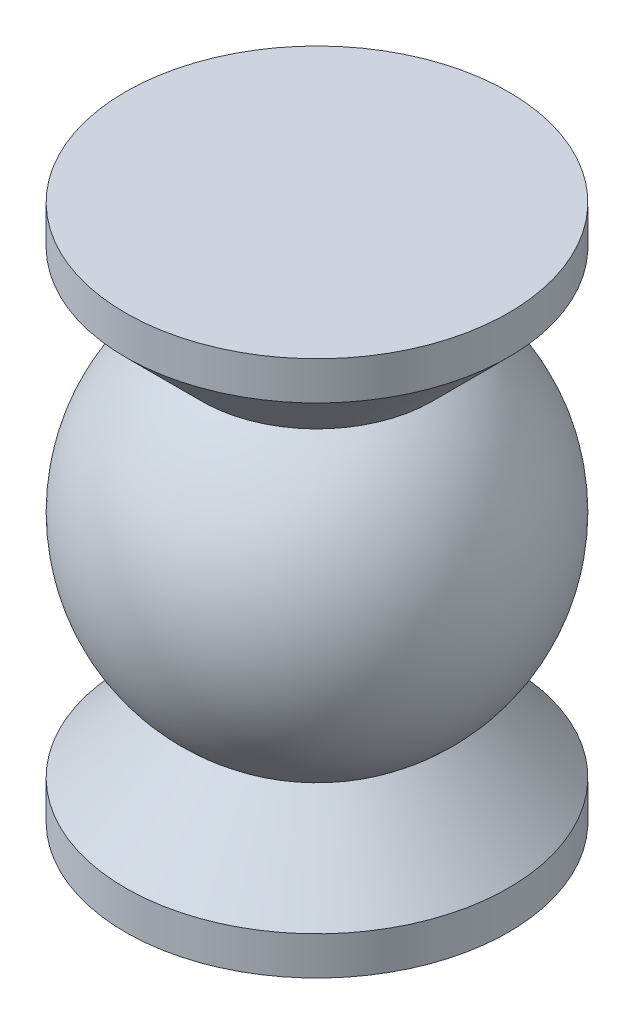
ISO-10303-21;
HEADER;
FILE_DESCRIPTION(('STEP AP214'),'2;1');
FILE_NAME('part.step','',(''),(''),'','','');
FILE_SCHEMA(('AUTOMOTIVE_DESIGN { 1 0 10303 214 1 1 1 1 }'));
ENDSEC;
DATA;
#1=APPLICATION_CONTEXT('core data for automotive mechanical design processes');
#2=APPLICATION_PROTOCOL_DEFINITION('international standard','automotive_design',2000,#1);
#3=PRODUCT_CONTEXT('',#1,'mechanical');
#4=PRODUCT('Part','Part','',(#3));
#5=PRODUCT_RELATED_PRODUCT_CATEGORY('part','',(#4));
#6=PRODUCT_DEFINITION_FORMATION('','',#4);
#7=PRODUCT_DEFINITION_CONTEXT('part definition',#1,'design');
#8=PRODUCT_DEFINITION('design','',#6,#7);
#9=PRODUCT_DEFINITION_SHAPE('','',#8);
#10=(LENGTH_UNIT() NAMED_UNIT(*) SI_UNIT(.MILLI.,.METRE.));
#11=(NAMED_UNIT(*) PLANE_ANGLE_UNIT() SI_UNIT($,.RADIAN.));
#12=(NAMED_UNIT(*) SI_UNIT($,.STERADIAN.) SOLID_ANGLE_UNIT());
#13=UNCERTAINTY_MEASURE_WITH_UNIT(LENGTH_MEASURE(1.E-05),#10,'distance_accuracy_value','');
#14=(GEOMETRIC_REPRESENTATION_CONTEXT(3) GLOBAL_UNCERTAINTY_ASSIGNED_CONTEXT((#13)) GLOBAL_UNIT_ASSIGNED_CONTEXT((#10,
#11,#12)) REPRESENTATION_CONTEXT('',''));
#15=CARTESIAN_POINT('',(0.,0.,0.));
#16=DIRECTION('',(0.,0.,1.));
#17=DIRECTION('',(1.,0.,0.));
#18=AXIS2_PLACEMENT_3D('',#15,#16,#17);
#19=CARTESIAN_POINT('',(0.,0.,0.));
#20=DIRECTION('',(0.,1.,0.));
#21=DIRECTION('',(1.,0.,0.));
#22=AXIS2_PLACEMENT_3D('',#19,#20,#21);
#23=SPHERICAL_SURFACE('',#22,25.);
#24=CARTESIAN_POINT('',(0.,20.,0.));
#25=DIRECTION('',(0.,1.,0.));
#26=DIRECTION('',(-1.,0.,0.));
#27=AXIS2_PLACEMENT_3D('',#24,#25,#26);
#28=CIRCLE('',#27,15.);
#29=CARTESIAN_POINT('',(15.,20.,0.));
#30=VERTEX_POINT('',#29);
#31=EDGE_CURVE('E10',#30,#30,#28,.T.);
#32=CARTESIAN_POINT('',(0.,-20.,0.));
#33=DIRECTION('',(0.,1.,0.));
#34=DIRECTION('',(-1.,0.,0.));
#35=AXIS2_PLACEMENT_3D('',#32,#33,#34);
#36=CIRCLE('',#35,15.);
#37=CARTESIAN_POINT('',(15.,-20.,0.));
#38=VERTEX_POINT('',#37);
#39=EDGE_CURVE('E46',#38,#38,#36,.T.);
#40=CARTESIAN_POINT('',(15.,20.,0.));
#41=CARTESIAN_POINT('',(15.386383877575,19.7102331585329,0.));
#42=CARTESIAN_POINT('',(15.764349304277,19.4092445387064,0.));
#43=CARTESIAN_POINT('',(16.5022218904126,18.785891059142,0.));
#44=CARTESIAN_POINT('',(16.8621290498462,18.4635261994041,0.));
#45=CARTESIAN_POINT('',(17.5626637359227,17.7984875568239,0.));
#46=CARTESIAN_POINT('',(17.9032912625656,17.4558137739817,0.));
#47=CARTESIAN_POINT('',(18.5641263057405,16.751312031891,0.));
#48=CARTESIAN_POINT('',(18.8843338222726,16.3894840726425,0.));
#49=CARTESIAN_POINT('',(19.5032526836538,15.6478878896459,0.));
#50=CARTESIAN_POINT('',(19.8019640285029,15.2681196658977,0.));
#51=CARTESIAN_POINT('',(20.3768877346255,14.4919184892619,0.));
#52=CARTESIAN_POINT('',(20.6531000958988,14.0954855363742,0.));
#53=CARTESIAN_POINT('',(21.1820982609088,13.2872860261715,0.));
#54=CARTESIAN_POINT('',(21.4348840646454,12.8755194688565,0.));
#55=CARTESIAN_POINT('',(21.9161802896365,12.0380354631662,0.));
#56=CARTESIAN_POINT('',(22.1446907108911,11.6123180147909,0.));
#57=CARTESIAN_POINT('',(22.5766688391047,10.748361760207,0.));
#58=CARTESIAN_POINT('',(22.7801365460637,10.3101229539983,0.));
#59=CARTESIAN_POINT('',(23.1613460121235,9.42259557021363,0.));
#60=CARTESIAN_POINT('',(23.3390877712243,8.97330699263762,0.));
#61=CARTESIAN_POINT('',(23.6682484928968,8.06518875528102,0.));
#62=CARTESIAN_POINT('',(23.8196674554685,7.60635909550044,0.));
#63=CARTESIAN_POINT('',(24.0956741265362,6.68069942190651,0.));
#64=CARTESIAN_POINT('',(24.2202618350321,6.21386940809315,0.));
#65=CARTESIAN_POINT('',(24.4421876383544,5.27377661927491,0.));
#66=CARTESIAN_POINT('',(24.5395257331807,4.80051384427003,0.));
#67=CARTESIAN_POINT('',(24.7066254525011,3.84914472685123,0.));
#68=CARTESIAN_POINT('',(24.7763870769951,3.37103838443733,0.));
#69=CARTESIAN_POINT('',(24.8880995994487,2.41158759044099,0.));
#70=CARTESIAN_POINT('',(24.9300504974084,1.93024313885856,0.));
#71=CARTESIAN_POINT('',(24.9860006976841,0.965932458184084,0.));
#72=CARTESIAN_POINT('',(25.,0.482966229092043,0.));
#73=CARTESIAN_POINT('',(25.,-0.482966229092038,0.));
#74=CARTESIAN_POINT('',(24.9860006976841,-0.965932458184078,0.));
#75=CARTESIAN_POINT('',(24.9300504974084,-1.93024313885855,0.));
#76=CARTESIAN_POINT('',(24.8880995994487,-2.41158759044098,0.));
#77=CARTESIAN_POINT('',(24.7763870769951,-3.37103838443732,0.));
#78=CARTESIAN_POINT('',(24.7066254525011,-3.84914472685123,0.));
#79=CARTESIAN_POINT('',(24.5395257331807,-4.80051384427002,0.));
#80=CARTESIAN_POINT('',(24.4421876383544,-5.27377661927491,0.));
#81=CARTESIAN_POINT('',(24.2202618350321,-6.21386940809315,0.));
#82=CARTESIAN_POINT('',(24.0956741265362,-6.6806994219065,0.));
#83=CARTESIAN_POINT('',(23.8196674554685,-7.60635909550043,0.));
#84=CARTESIAN_POINT('',(23.6682484928968,-8.06518875528101,0.));
#85=CARTESIAN_POINT('',(23.3390877712243,-8.97330699263761,0.));
#86=CARTESIAN_POINT('',(23.1613460121235,-9.42259557021362,0.));
#87=CARTESIAN_POINT('',(22.7801365460637,-10.3101229539983,0.));
#88=CARTESIAN_POINT('',(22.5766688391047,-10.748361760207,0.));
#89=CARTESIAN_POINT('',(22.1446907108911,-11.6123180147909,0.));
#90=CARTESIAN_POINT('',(21.9161802896365,-12.0380354631662,0.));
#91=CARTESIAN_POINT('',(21.4348840646454,-12.8755194688565,0.));
#92=CARTESIAN_POINT('',(21.1820982609088,-13.2872860261715,0.));
#93=CARTESIAN_POINT('',(20.6531000958988,-14.0954855363742,0.));
#94=CARTESIAN_POINT('',(20.3768877346255,-14.4919184892619,0.));
#95=CARTESIAN_POINT('',(19.8019640285029,-15.2681196658977,0.));
#96=CARTESIAN_POINT('',(19.5032526836538,-15.6478878896459,0.));
#97=CARTESIAN_POINT('',(18.8843338222726,-16.3894840726425,0.));
#98=CARTESIAN_POINT('',(18.5641263057405,-16.751312031891,0.));
#99=CARTESIAN_POINT('',(17.9032912625656,-17.4558137739817,0.));
#100=CARTESIAN_POINT('',(17.5626637359227,-17.7984875568239,0.));
#101=CARTESIAN_POINT('',(16.8621290498462,-18.4635261994041,0.));
#102=CARTESIAN_POINT('',(16.5022218904126,-18.785891059142,0.));
#103=CARTESIAN_POINT('',(15.764349304277,-19.4092445387064,0.));
#104=CARTESIAN_POINT('',(15.386383877575,-19.7102331585328,0.));
#105=CARTESIAN_POINT('',(15.,-20.,0.));
#106=B_SPLINE_CURVE_WITH_KNOTS('',3,(#40,#41,#42,#43,#44,#45,#46,#47,#48,#49,#50,#51,#52,#53,
#54,#55,#56,#57,#58,#59,#60,#61,#62,#63,#64,#65,#66,#67,#68,#69,#70,#71,#72,#73,#74,#75,#76,#77,
#78,#79,#80,#81,#82,#83,#84,#85,#86,#87,#88,#89,#90,#91,#92,#93,#94,#95,#96,#97,#98,#99,#100,
#101,#102,#103,#104,#105),.UNSPECIFIED.,.F.,.F.,(4,2,2,2,2,2,2,2,2,2,2,2,2,2,2,2,2,2,2,2,2,2,2,
2,2,2,2,2,2,2,2,2,4),(0.,1.4486960076868,2.8973920153736,4.3460880230604,5.79478403074719,
7.24348003843398,8.69217604612078,10.1408720538076,11.5895680614944,13.0382640691812,
14.486960076868,15.9356560845548,17.3843520922416,18.8330480999284,20.2817441076152,
21.730440115302,23.1791361229888,24.6278321306756,26.0765281383624,27.5252241460492,
28.9739201537359,30.4226161614227,31.8713121691095,33.3200081767963,34.7687041844831,
36.2174001921699,37.6660961998567,39.1147922075435,40.5634882152303,42.0121842229171,
43.4608802306039,44.9095762382907,46.3582722459775),.UNSPECIFIED.);
#107=EDGE_CURVE('BSEAM32',#30,#38,#106,.T.);
#108=ORIENTED_EDGE('',*,*,#31,.F.);
#109=ORIENTED_EDGE('',*,*,#39,.T.);
#110=ORIENTED_EDGE('',*,*,#107,.T.);
#111=ORIENTED_EDGE('',*,*,#107,.F.);
#112=EDGE_LOOP('',(#108,#110,#109,#111));
#113=FACE_BOUND('',#112,.T.);
#114=ADVANCED_FACE('F32',(#113),#23,.T.);
#115=CARTESIAN_POINT('',(0.,20.,0.));
#116=DIRECTION('',(0.,1.,0.));
#117=DIRECTION('',(-1.,0.,0.));
#118=AXIS2_PLACEMENT_3D('',#115,#116,#117);
#119=CONICAL_SURFACE('',#118,15.,0.785398163397449);
#120=CARTESIAN_POINT('',(0.,30.,0.));
#121=DIRECTION('',(0.,1.,0.));
#122=DIRECTION('',(-1.,0.,0.));
#123=AXIS2_PLACEMENT_3D('',#120,#121,#122);
#124=CIRCLE('',#123,25.);
#125=CARTESIAN_POINT('',(-25.,30.,0.));
#126=VERTEX_POINT('',#125);
#127=EDGE_CURVE('E38',#126,#126,#124,.T.);
#128=ORIENTED_EDGE('',*,*,#127,.F.);
#129=EDGE_LOOP('',(#128));
#130=FACE_BOUND('',#129,.T.);
#131=ORIENTED_EDGE('',*,*,#31,.T.);
#132=EDGE_LOOP('',(#131));
#133=FACE_BOUND('',#132,.T.);
#134=ADVANCED_FACE('F70',(#130,#133),#119,.T.);
#135=CARTESIAN_POINT('',(0.,35.,0.));
#136=DIRECTION('',(0.,1.,0.));
#137=DIRECTION('',(-1.,0.,0.));
#138=AXIS2_PLACEMENT_3D('',#135,#136,#137);
#139=CYLINDRICAL_SURFACE('',#138,25.);
#140=CARTESIAN_POINT('',(0.,35.,0.));
#141=DIRECTION('',(0.,1.,0.));
#142=DIRECTION('',(-1.,0.,0.));
#143=AXIS2_PLACEMENT_3D('',#140,#141,#142);
#144=CIRCLE('',#143,25.);
#145=CARTESIAN_POINT('',(-25.,35.,0.));
#146=VERTEX_POINT('',#145);
#147=EDGE_CURVE('E42',#146,#146,#144,.T.);
#148=ORIENTED_EDGE('',*,*,#147,.F.);
#149=EDGE_LOOP('',(#148));
#150=FACE_BOUND('',#149,.T.);
#151=ORIENTED_EDGE('',*,*,#127,.T.);
#152=EDGE_LOOP('',(#151));
#153=FACE_BOUND('',#152,.T.);
#154=ADVANCED_FACE('F75',(#150,#153),#139,.T.);
#155=CARTESIAN_POINT('',(25.,35.,0.));
#156=DIRECTION('',(0.,-1.,0.));
#157=DIRECTION('',(1.,0.,0.));
#158=AXIS2_PLACEMENT_3D('',#155,#156,#157);
#159=PLANE('',#158);
#160=ORIENTED_EDGE('',*,*,#147,.T.);
#161=EDGE_LOOP('',(#160));
#162=FACE_BOUND('',#161,.T.);
#163=ADVANCED_FACE('F81',(#162),#159,.F.);
#164=CARTESIAN_POINT('',(0.,-20.,0.));
#165=DIRECTION('',(0.,-1.,0.));
#166=DIRECTION('',(-1.,0.,0.));
#167=AXIS2_PLACEMENT_3D('',#164,#165,#166);
#168=CONICAL_SURFACE('',#167,15.,0.785398163397449);
#169=CARTESIAN_POINT('',(0.,-30.,0.));
#170=DIRECTION('',(0.,1.,0.));
#171=DIRECTION('',(-1.,0.,0.));
#172=AXIS2_PLACEMENT_3D('',#169,#170,#171);
#173=CIRCLE('',#172,25.);
#174=CARTESIAN_POINT('',(-25.,-30.,0.));
#175=VERTEX_POINT('',#174);
#176=EDGE_CURVE('E51',#175,#175,#173,.T.);
#177=ORIENTED_EDGE('',*,*,#176,.T.);
#178=EDGE_LOOP('',(#177));
#179=FACE_BOUND('',#178,.T.);
#180=ORIENTED_EDGE('',*,*,#39,.F.);
#181=EDGE_LOOP('',(#180));
#182=FACE_BOUND('',#181,.T.);
#183=ADVANCED_FACE('F67',(#179,#182),#168,.T.);
#184=CARTESIAN_POINT('',(0.,-35.,0.));
#185=DIRECTION('',(0.,-1.,0.));
#186=DIRECTION('',(-1.,0.,0.));
#187=AXIS2_PLACEMENT_3D('',#184,#185,#186);
#188=CYLINDRICAL_SURFACE('',#187,25.);
#189=CARTESIAN_POINT('',(0.,-35.,0.));
#190=DIRECTION('',(0.,1.,0.));
#191=DIRECTION('',(-1.,0.,0.));
#192=AXIS2_PLACEMENT_3D('',#189,#190,#191);
#193=CIRCLE('',#192,25.);
#194=CARTESIAN_POINT('',(-25.,-35.,0.));
#195=VERTEX_POINT('',#194);
#196=EDGE_CURVE('E54',#195,#195,#193,.T.);
#197=ORIENTED_EDGE('',*,*,#196,.T.);
#198=EDGE_LOOP('',(#197));
#199=FACE_BOUND('',#198,.T.);
#200=ORIENTED_EDGE('',*,*,#176,.F.);
#201=EDGE_LOOP('',(#200));
#202=FACE_BOUND('',#201,.T.);
#203=ADVANCED_FACE('F58',(#199,#202),#188,.T.);
#204=CARTESIAN_POINT('',(25.,-35.,0.));
#205=DIRECTION('',(0.,1.,0.));
#206=DIRECTION('',(1.,0.,0.));
#207=AXIS2_PLACEMENT_3D('',#204,#205,#206);
#208=PLANE('',#207);
#209=ORIENTED_EDGE('',*,*,#196,.F.);
#210=EDGE_LOOP('',(#209));
#211=FACE_BOUND('',#210,.T.);
#212=ADVANCED_FACE('F61',(#211),#208,.F.);
#213=CLOSED_SHELL('',(#114,#134,#154,#163,#183,#203,#212));
#214=MANIFOLD_SOLID_BREP('B2',#213);
#215=ADVANCED_BREP_SHAPE_REPRESENTATION('',(#18,#214),#14);
#216=SHAPE_DEFINITION_REPRESENTATION(#9,#215);
ENDSEC;
END-ISO-10303-21;
